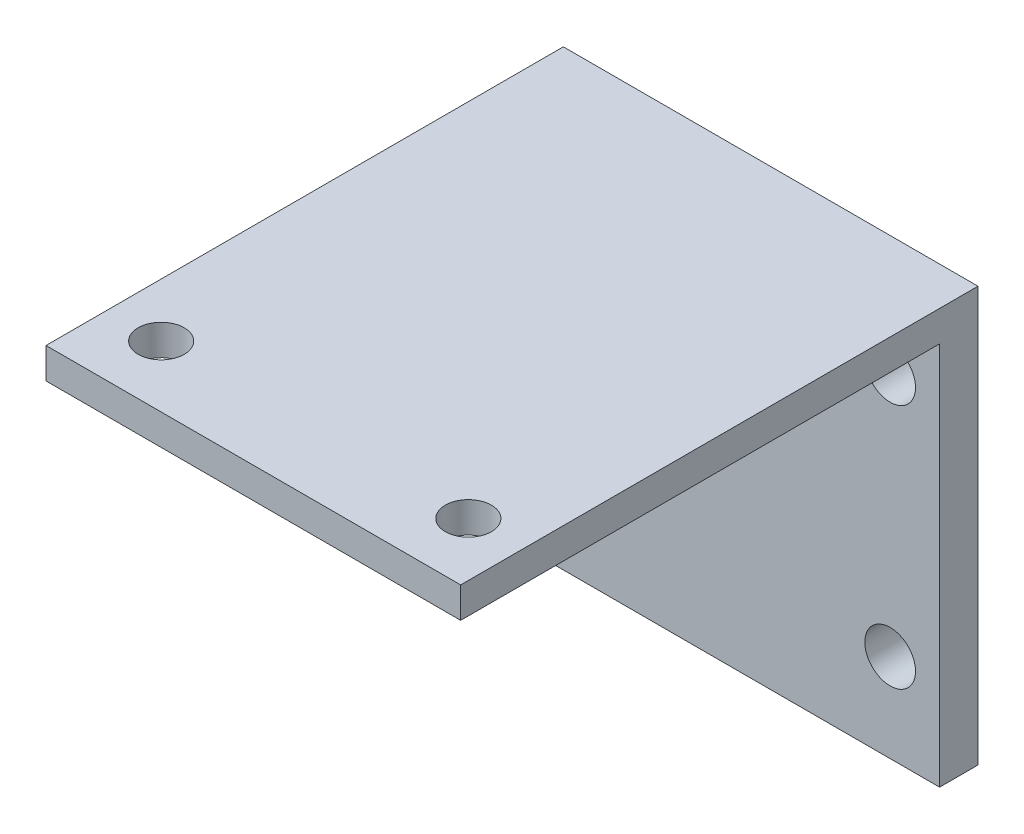
ISO-10303-21;
HEADER;
FILE_DESCRIPTION(('STEP AP214'),'2;1');
FILE_NAME('part.step','',(''),(''),'','','');
FILE_SCHEMA(('AUTOMOTIVE_DESIGN { 1 0 10303 214 1 1 1 1 }'));
ENDSEC;
DATA;
#1=APPLICATION_CONTEXT('core data for automotive mechanical design processes');
#2=APPLICATION_PROTOCOL_DEFINITION('international standard','automotive_design',2000,#1);
#3=PRODUCT_CONTEXT('',#1,'mechanical');
#4=PRODUCT('Part','Part','',(#3));
#5=PRODUCT_RELATED_PRODUCT_CATEGORY('part','',(#4));
#6=PRODUCT_DEFINITION_FORMATION('','',#4);
#7=PRODUCT_DEFINITION_CONTEXT('part definition',#1,'design');
#8=PRODUCT_DEFINITION('design','',#6,#7);
#9=PRODUCT_DEFINITION_SHAPE('','',#8);
#10=(LENGTH_UNIT() NAMED_UNIT(*) SI_UNIT(.MILLI.,.METRE.));
#11=(NAMED_UNIT(*) PLANE_ANGLE_UNIT() SI_UNIT($,.RADIAN.));
#12=(NAMED_UNIT(*) SI_UNIT($,.STERADIAN.) SOLID_ANGLE_UNIT());
#13=UNCERTAINTY_MEASURE_WITH_UNIT(LENGTH_MEASURE(1.E-05),#10,'distance_accuracy_value','');
#14=(GEOMETRIC_REPRESENTATION_CONTEXT(3) GLOBAL_UNCERTAINTY_ASSIGNED_CONTEXT((#13)) GLOBAL_UNIT_ASSIGNED_CONTEXT((#10,
#11,#12)) REPRESENTATION_CONTEXT('',''));
#15=CARTESIAN_POINT('',(0.,0.,0.));
#16=DIRECTION('',(0.,0.,1.));
#17=DIRECTION('',(1.,0.,0.));
#18=AXIS2_PLACEMENT_3D('',#15,#16,#17);
#19=CARTESIAN_POINT('',(0.,-27.,67.37));
#20=DIRECTION('',(0.,1.,0.));
#21=DIRECTION('',(0.,0.,1.));
#22=AXIS2_PLACEMENT_3D('',#19,#20,#21);
#23=PLANE('',#22);
#24=DIRECTION('',(1.,0.,0.));
#25=VECTOR('',#24,1.);
#26=CARTESIAN_POINT('',(0.,-27.,5.));
#27=LINE('',#26,#25);
#28=CARTESIAN_POINT('',(-27.,-27.,5.));
#29=VERTEX_POINT('',#28);
#30=CARTESIAN_POINT('',(27.,-27.,5.));
#31=VERTEX_POINT('',#30);
#32=EDGE_CURVE('E136',#29,#31,#27,.T.);
#33=ORIENTED_EDGE('',*,*,#32,.F.);
#34=DIRECTION('',(0.,0.,-1.));
#35=VECTOR('',#34,1.);
#36=CARTESIAN_POINT('',(-27.,-27.,67.37));
#37=LINE('',#36,#35);
#38=CARTESIAN_POINT('',(-27.,-27.,0.));
#39=VERTEX_POINT('',#38);
#40=EDGE_CURVE('E143',#29,#39,#37,.T.);
#41=ORIENTED_EDGE('',*,*,#40,.T.);
#42=DIRECTION('',(1.,0.,0.));
#43=VECTOR('',#42,1.);
#44=CARTESIAN_POINT('',(0.,-27.,0.));
#45=LINE('',#44,#43);
#46=CARTESIAN_POINT('',(27.,-27.,0.));
#47=VERTEX_POINT('',#46);
#48=EDGE_CURVE('E127',#39,#47,#45,.T.);
#49=ORIENTED_EDGE('',*,*,#48,.T.);
#50=DIRECTION('',(0.,0.,-1.));
#51=VECTOR('',#50,1.);
#52=CARTESIAN_POINT('',(27.,-27.,67.37));
#53=LINE('',#52,#51);
#54=EDGE_CURVE('E117',#31,#47,#53,.T.);
#55=ORIENTED_EDGE('',*,*,#54,.F.);
#56=EDGE_LOOP('',(#33,#41,#49,#55));
#57=FACE_BOUND('',#56,.T.);
#58=ADVANCED_FACE('F64',(#57),#23,.F.);
#59=CARTESIAN_POINT('',(-27.,0.,67.37));
#60=DIRECTION('',(-1.,0.,0.));
#61=DIRECTION('',(0.,0.,1.));
#62=AXIS2_PLACEMENT_3D('',#59,#60,#61);
#63=PLANE('',#62);
#64=DIRECTION('',(0.,0.,-1.));
#65=VECTOR('',#64,1.);
#66=CARTESIAN_POINT('',(-27.,23.,67.37));
#67=LINE('',#66,#65);
#68=CARTESIAN_POINT('',(-27.,23.,67.37));
#69=VERTEX_POINT('',#68);
#70=CARTESIAN_POINT('',(-27.,23.,5.));
#71=VERTEX_POINT('',#70);
#72=EDGE_CURVE('E176',#69,#71,#67,.T.);
#73=ORIENTED_EDGE('',*,*,#72,.F.);
#74=DIRECTION('',(0.,1.,0.));
#75=VECTOR('',#74,1.);
#76=CARTESIAN_POINT('',(-27.,0.,67.37));
#77=LINE('',#76,#75);
#78=CARTESIAN_POINT('',(-27.,27.,67.37));
#79=VERTEX_POINT('',#78);
#80=EDGE_CURVE('E181',#69,#79,#77,.T.);
#81=ORIENTED_EDGE('',*,*,#80,.T.);
#82=DIRECTION('',(0.,0.,-1.));
#83=VECTOR('',#82,1.);
#84=CARTESIAN_POINT('',(-27.,27.,67.37));
#85=LINE('',#84,#83);
#86=CARTESIAN_POINT('',(-27.,27.,0.));
#87=VERTEX_POINT('',#86);
#88=EDGE_CURVE('E145',#79,#87,#85,.T.);
#89=ORIENTED_EDGE('',*,*,#88,.T.);
#90=DIRECTION('',(0.,1.,0.));
#91=VECTOR('',#90,1.);
#92=CARTESIAN_POINT('',(-27.,0.,0.));
#93=LINE('',#92,#91);
#94=EDGE_CURVE('E131',#39,#87,#93,.T.);
#95=ORIENTED_EDGE('',*,*,#94,.F.);
#96=ORIENTED_EDGE('',*,*,#40,.F.);
#97=DIRECTION('',(0.,1.,0.));
#98=VECTOR('',#97,1.);
#99=CARTESIAN_POINT('',(-27.,0.,5.));
#100=LINE('',#99,#98);
#101=EDGE_CURVE('E132',#29,#71,#100,.T.);
#102=ORIENTED_EDGE('',*,*,#101,.T.);
#103=EDGE_LOOP('',(#73,#81,#89,#95,#96,#102));
#104=FACE_BOUND('',#103,.T.);
#105=ADVANCED_FACE('F185',(#104),#63,.T.);
#106=CARTESIAN_POINT('',(27.,0.,67.37));
#107=DIRECTION('',(-1.,0.,0.));
#108=DIRECTION('',(0.,0.,1.));
#109=AXIS2_PLACEMENT_3D('',#106,#107,#108);
#110=PLANE('',#109);
#111=DIRECTION('',(0.,1.,0.));
#112=VECTOR('',#111,1.);
#113=CARTESIAN_POINT('',(27.,0.,67.37));
#114=LINE('',#113,#112);
#115=CARTESIAN_POINT('',(27.,23.,67.37));
#116=VERTEX_POINT('',#115);
#117=CARTESIAN_POINT('',(27.,27.,67.37));
#118=VERTEX_POINT('',#117);
#119=EDGE_CURVE('E89',#116,#118,#114,.T.);
#120=ORIENTED_EDGE('',*,*,#119,.F.);
#121=DIRECTION('',(0.,0.,-1.));
#122=VECTOR('',#121,1.);
#123=CARTESIAN_POINT('',(27.,23.,67.37));
#124=LINE('',#123,#122);
#125=CARTESIAN_POINT('',(27.,23.,5.));
#126=VERTEX_POINT('',#125);
#127=EDGE_CURVE('E81',#116,#126,#124,.T.);
#128=ORIENTED_EDGE('',*,*,#127,.T.);
#129=DIRECTION('',(0.,1.,0.));
#130=VECTOR('',#129,1.);
#131=CARTESIAN_POINT('',(27.,0.,5.));
#132=LINE('',#131,#130);
#133=EDGE_CURVE('E12',#31,#126,#132,.T.);
#134=ORIENTED_EDGE('',*,*,#133,.F.);
#135=ORIENTED_EDGE('',*,*,#54,.T.);
#136=DIRECTION('',(0.,1.,0.));
#137=VECTOR('',#136,1.);
#138=CARTESIAN_POINT('',(27.,0.,0.));
#139=LINE('',#138,#137);
#140=CARTESIAN_POINT('',(27.,27.,0.));
#141=VERTEX_POINT('',#140);
#142=EDGE_CURVE('E120',#47,#141,#139,.T.);
#143=ORIENTED_EDGE('',*,*,#142,.T.);
#144=DIRECTION('',(0.,0.,-1.));
#145=VECTOR('',#144,1.);
#146=CARTESIAN_POINT('',(27.,27.,67.37));
#147=LINE('',#146,#145);
#148=EDGE_CURVE('E109',#118,#141,#147,.T.);
#149=ORIENTED_EDGE('',*,*,#148,.F.);
#150=EDGE_LOOP('',(#120,#128,#134,#135,#143,#149));
#151=FACE_BOUND('',#150,.T.);
#152=ADVANCED_FACE('F121',(#151),#110,.F.);
#153=CARTESIAN_POINT('',(0.,27.,67.37));
#154=DIRECTION('',(0.,1.,0.));
#155=DIRECTION('',(0.,0.,1.));
#156=AXIS2_PLACEMENT_3D('',#153,#154,#155);
#157=PLANE('',#156);
#158=CARTESIAN_POINT('',(20.,27.,59.37));
#159=DIRECTION('',(0.,1.,0.));
#160=DIRECTION('',(0.,0.,1.));
#161=AXIS2_PLACEMENT_3D('',#158,#159,#160);
#162=CIRCLE('',#161,3.);
#163=CARTESIAN_POINT('',(20.,27.,62.37));
#164=VERTEX_POINT('',#163);
#165=EDGE_CURVE('E154',#164,#164,#162,.T.);
#166=ORIENTED_EDGE('',*,*,#165,.F.);
#167=EDGE_LOOP('',(#166));
#168=FACE_BOUND('',#167,.T.);
#169=CARTESIAN_POINT('',(-20.,27.,59.37));
#170=DIRECTION('',(0.,1.,0.));
#171=DIRECTION('',(0.,0.,1.));
#172=AXIS2_PLACEMENT_3D('',#169,#170,#171);
#173=CIRCLE('',#172,3.);
#174=CARTESIAN_POINT('',(-20.,27.,62.37));
#175=VERTEX_POINT('',#174);
#176=EDGE_CURVE('E169',#175,#175,#173,.T.);
#177=ORIENTED_EDGE('',*,*,#176,.F.);
#178=EDGE_LOOP('',(#177));
#179=FACE_BOUND('',#178,.T.);
#180=DIRECTION('',(1.,0.,0.));
#181=VECTOR('',#180,1.);
#182=CARTESIAN_POINT('',(0.,27.,0.));
#183=LINE('',#182,#181);
#184=EDGE_CURVE('E113',#87,#141,#183,.T.);
#185=ORIENTED_EDGE('',*,*,#184,.F.);
#186=ORIENTED_EDGE('',*,*,#88,.F.);
#187=DIRECTION('',(1.,0.,0.));
#188=VECTOR('',#187,1.);
#189=CARTESIAN_POINT('',(0.,27.,67.37));
#190=LINE('',#189,#188);
#191=EDGE_CURVE('E115',#79,#118,#190,.T.);
#192=ORIENTED_EDGE('',*,*,#191,.T.);
#193=ORIENTED_EDGE('',*,*,#148,.T.);
#194=EDGE_LOOP('',(#185,#186,#192,#193));
#195=FACE_BOUND('',#194,.T.);
#196=ADVANCED_FACE('F66',(#168,#179,#195),#157,.T.);
#197=CARTESIAN_POINT('',(0.,0.,0.));
#198=DIRECTION('',(0.,0.,1.));
#199=DIRECTION('',(1.,0.,0.));
#200=AXIS2_PLACEMENT_3D('',#197,#198,#199);
#201=PLANE('',#200);
#202=CARTESIAN_POINT('',(20.5628173044252,-15.5000000000001,0.));
#203=DIRECTION('',(0.,0.,-1.));
#204=DIRECTION('',(-1.,0.,0.));
#205=AXIS2_PLACEMENT_3D('',#202,#203,#204);
#206=CIRCLE('',#205,3.29999999999999);
#207=CARTESIAN_POINT('',(17.2628173044252,-15.5000000000001,0.));
#208=VERTEX_POINT('',#207);
#209=EDGE_CURVE('E161',#208,#208,#206,.T.);
#210=ORIENTED_EDGE('',*,*,#209,.F.);
#211=EDGE_LOOP('',(#210));
#212=FACE_BOUND('',#211,.T.);
#213=CARTESIAN_POINT('',(20.5628173044252,16.4999999999999,0.));
#214=DIRECTION('',(0.,0.,-1.));
#215=DIRECTION('',(-1.,0.,0.));
#216=AXIS2_PLACEMENT_3D('',#213,#214,#215);
#217=CIRCLE('',#216,3.29999999999999);
#218=CARTESIAN_POINT('',(17.2628173044252,16.4999999999999,0.));
#219=VERTEX_POINT('',#218);
#220=EDGE_CURVE('E150',#219,#219,#217,.T.);
#221=ORIENTED_EDGE('',*,*,#220,.F.);
#222=EDGE_LOOP('',(#221));
#223=FACE_BOUND('',#222,.T.);
#224=ORIENTED_EDGE('',*,*,#184,.T.);
#225=ORIENTED_EDGE('',*,*,#142,.F.);
#226=ORIENTED_EDGE('',*,*,#48,.F.);
#227=ORIENTED_EDGE('',*,*,#94,.T.);
#228=EDGE_LOOP('',(#224,#225,#226,#227));
#229=FACE_BOUND('',#228,.T.);
#230=ADVANCED_FACE('F129',(#212,#223,#229),#201,.F.);
#231=CARTESIAN_POINT('',(0.,0.,67.37));
#232=DIRECTION('',(0.,0.,1.));
#233=DIRECTION('',(1.,0.,0.));
#234=AXIS2_PLACEMENT_3D('',#231,#232,#233);
#235=PLANE('',#234);
#236=DIRECTION('',(-1.,0.,0.));
#237=VECTOR('',#236,1.);
#238=CARTESIAN_POINT('',(0.,23.,67.37));
#239=LINE('',#238,#237);
#240=EDGE_CURVE('E73',#116,#69,#239,.T.);
#241=ORIENTED_EDGE('',*,*,#240,.F.);
#242=ORIENTED_EDGE('',*,*,#119,.T.);
#243=ORIENTED_EDGE('',*,*,#191,.F.);
#244=ORIENTED_EDGE('',*,*,#80,.F.);
#245=EDGE_LOOP('',(#241,#242,#243,#244));
#246=FACE_BOUND('',#245,.T.);
#247=ADVANCED_FACE('F187',(#246),#235,.T.);
#248=CARTESIAN_POINT('',(38.7750425347235,23.,5.));
#249=DIRECTION('',(0.,1.,0.));
#250=DIRECTION('',(0.,0.,1.));
#251=AXIS2_PLACEMENT_3D('',#248,#249,#250);
#252=PLANE('',#251);
#253=CARTESIAN_POINT('',(20.,23.,59.37));
#254=DIRECTION('',(0.,-1.,0.));
#255=DIRECTION('',(0.,0.,-1.));
#256=AXIS2_PLACEMENT_3D('',#253,#254,#255);
#257=CIRCLE('',#256,3.);
#258=CARTESIAN_POINT('',(20.,23.,56.37));
#259=VERTEX_POINT('',#258);
#260=EDGE_CURVE('E149',#259,#259,#257,.T.);
#261=ORIENTED_EDGE('',*,*,#260,.F.);
#262=EDGE_LOOP('',(#261));
#263=FACE_BOUND('',#262,.T.);
#264=CARTESIAN_POINT('',(-20.,23.,59.37));
#265=DIRECTION('',(0.,-1.,0.));
#266=DIRECTION('',(0.,0.,-1.));
#267=AXIS2_PLACEMENT_3D('',#264,#265,#266);
#268=CIRCLE('',#267,3.);
#269=CARTESIAN_POINT('',(-20.,23.,56.37));
#270=VERTEX_POINT('',#269);
#271=EDGE_CURVE('E166',#270,#270,#268,.T.);
#272=ORIENTED_EDGE('',*,*,#271,.F.);
#273=EDGE_LOOP('',(#272));
#274=FACE_BOUND('',#273,.T.);
#275=ORIENTED_EDGE('',*,*,#72,.T.);
#276=DIRECTION('',(-1.,0.,0.));
#277=VECTOR('',#276,1.);
#278=CARTESIAN_POINT('',(38.7750425347235,23.,5.));
#279=LINE('',#278,#277);
#280=EDGE_CURVE('E172',#126,#71,#279,.T.);
#281=ORIENTED_EDGE('',*,*,#280,.F.);
#282=ORIENTED_EDGE('',*,*,#127,.F.);
#283=ORIENTED_EDGE('',*,*,#240,.T.);
#284=EDGE_LOOP('',(#275,#281,#282,#283));
#285=FACE_BOUND('',#284,.T.);
#286=ADVANCED_FACE('F189',(#263,#274,#285),#252,.F.);
#287=CARTESIAN_POINT('',(0.,0.,5.));
#288=DIRECTION('',(0.,0.,1.));
#289=DIRECTION('',(1.,0.,0.));
#290=AXIS2_PLACEMENT_3D('',#287,#288,#289);
#291=PLANE('',#290);
#292=CARTESIAN_POINT('',(20.5628173044252,-15.5000000000001,5.));
#293=DIRECTION('',(0.,0.,1.));
#294=DIRECTION('',(1.,0.,0.));
#295=AXIS2_PLACEMENT_3D('',#292,#293,#294);
#296=CIRCLE('',#295,3.29999999999999);
#297=CARTESIAN_POINT('',(23.8628173044252,-15.5000000000001,5.));
#298=VERTEX_POINT('',#297);
#299=EDGE_CURVE('E68',#298,#298,#296,.T.);
#300=ORIENTED_EDGE('',*,*,#299,.F.);
#301=EDGE_LOOP('',(#300));
#302=FACE_BOUND('',#301,.T.);
#303=CARTESIAN_POINT('',(20.5628173044252,16.4999999999999,5.));
#304=DIRECTION('',(0.,0.,1.));
#305=DIRECTION('',(1.,0.,0.));
#306=AXIS2_PLACEMENT_3D('',#303,#304,#305);
#307=CIRCLE('',#306,3.29999999999999);
#308=CARTESIAN_POINT('',(23.8628173044252,16.4999999999999,5.));
#309=VERTEX_POINT('',#308);
#310=EDGE_CURVE('E147',#309,#309,#307,.T.);
#311=ORIENTED_EDGE('',*,*,#310,.F.);
#312=EDGE_LOOP('',(#311));
#313=FACE_BOUND('',#312,.T.);
#314=ORIENTED_EDGE('',*,*,#32,.T.);
#315=ORIENTED_EDGE('',*,*,#133,.T.);
#316=ORIENTED_EDGE('',*,*,#280,.T.);
#317=ORIENTED_EDGE('',*,*,#101,.F.);
#318=EDGE_LOOP('',(#314,#315,#316,#317));
#319=FACE_BOUND('',#318,.T.);
#320=ADVANCED_FACE('F195',(#302,#313,#319),#291,.T.);
#321=CARTESIAN_POINT('',(-20.,85.37,59.37));
#322=DIRECTION('',(0.,-1.,0.));
#323=DIRECTION('',(0.,0.,-1.));
#324=AXIS2_PLACEMENT_3D('',#321,#322,#323);
#325=CYLINDRICAL_SURFACE('',#324,3.);
#326=ORIENTED_EDGE('',*,*,#176,.T.);
#327=EDGE_LOOP('',(#326));
#328=FACE_BOUND('',#327,.T.);
#329=ORIENTED_EDGE('',*,*,#271,.T.);
#330=EDGE_LOOP('',(#329));
#331=FACE_BOUND('',#330,.T.);
#332=ADVANCED_FACE('F219',(#328,#331),#325,.F.);
#333=CARTESIAN_POINT('',(20.,85.37,59.37));
#334=DIRECTION('',(0.,-1.,0.));
#335=DIRECTION('',(0.,0.,-1.));
#336=AXIS2_PLACEMENT_3D('',#333,#334,#335);
#337=CYLINDRICAL_SURFACE('',#336,3.);
#338=ORIENTED_EDGE('',*,*,#165,.T.);
#339=EDGE_LOOP('',(#338));
#340=FACE_BOUND('',#339,.T.);
#341=ORIENTED_EDGE('',*,*,#260,.T.);
#342=EDGE_LOOP('',(#341));
#343=FACE_BOUND('',#342,.T.);
#344=ADVANCED_FACE('F222',(#340,#343),#337,.F.);
#345=CARTESIAN_POINT('',(20.5628173044252,16.4999999999999,0.));
#346=DIRECTION('',(0.,0.,-1.));
#347=DIRECTION('',(-1.,0.,0.));
#348=AXIS2_PLACEMENT_3D('',#345,#346,#347);
#349=CYLINDRICAL_SURFACE('',#348,3.29999999999999);
#350=ORIENTED_EDGE('',*,*,#310,.T.);
#351=EDGE_LOOP('',(#350));
#352=FACE_BOUND('',#351,.T.);
#353=ORIENTED_EDGE('',*,*,#220,.T.);
#354=EDGE_LOOP('',(#353));
#355=FACE_BOUND('',#354,.T.);
#356=ADVANCED_FACE('F246',(#352,#355),#349,.F.);
#357=CARTESIAN_POINT('',(20.5628173044252,-15.5000000000001,0.));
#358=DIRECTION('',(0.,0.,-1.));
#359=DIRECTION('',(-1.,0.,0.));
#360=AXIS2_PLACEMENT_3D('',#357,#358,#359);
#361=CYLINDRICAL_SURFACE('',#360,3.29999999999999);
#362=ORIENTED_EDGE('',*,*,#299,.T.);
#363=EDGE_LOOP('',(#362));
#364=FACE_BOUND('',#363,.T.);
#365=ORIENTED_EDGE('',*,*,#209,.T.);
#366=EDGE_LOOP('',(#365));
#367=FACE_BOUND('',#366,.T.);
#368=ADVANCED_FACE('F250',(#364,#367),#361,.F.);
#369=CLOSED_SHELL('',(#58,#105,#152,#196,#230,#247,#286,#320,#332,#344,#356,#368));
#370=MANIFOLD_SOLID_BREP('B2',#369);
#371=ADVANCED_BREP_SHAPE_REPRESENTATION('',(#18,#370),#14);
#372=SHAPE_DEFINITION_REPRESENTATION(#9,#371);
ENDSEC;
END-ISO-10303-21;
